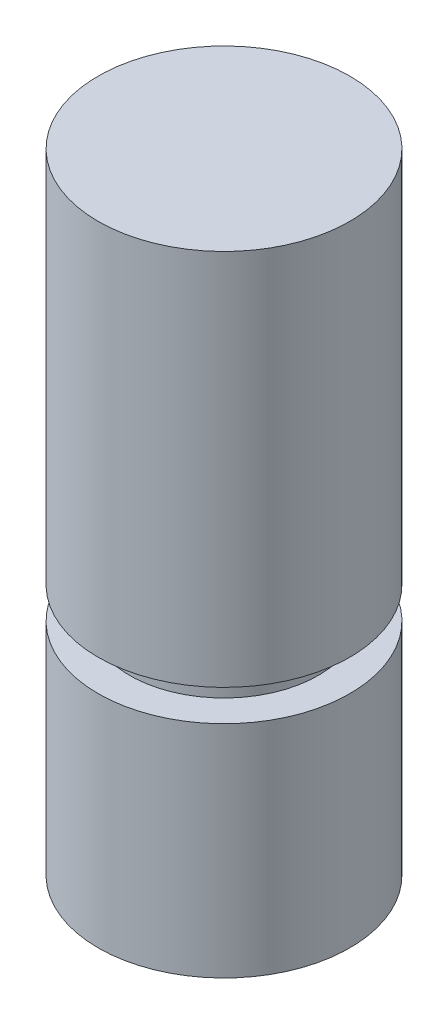
ISO-10303-21;
HEADER;
FILE_DESCRIPTION(('STEP AP214'),'2;1');
FILE_NAME('part.step','',(''),(''),'','','');
FILE_SCHEMA(('AUTOMOTIVE_DESIGN { 1 0 10303 214 1 1 1 1 }'));
ENDSEC;
DATA;
#1=APPLICATION_CONTEXT('core data for automotive mechanical design processes');
#2=APPLICATION_PROTOCOL_DEFINITION('international standard','automotive_design',2000,#1);
#3=PRODUCT_CONTEXT('',#1,'mechanical');
#4=PRODUCT('Part','Part','',(#3));
#5=PRODUCT_RELATED_PRODUCT_CATEGORY('part','',(#4));
#6=PRODUCT_DEFINITION_FORMATION('','',#4);
#7=PRODUCT_DEFINITION_CONTEXT('part definition',#1,'design');
#8=PRODUCT_DEFINITION('design','',#6,#7);
#9=PRODUCT_DEFINITION_SHAPE('','',#8);
#10=(LENGTH_UNIT() NAMED_UNIT(*) SI_UNIT(.MILLI.,.METRE.));
#11=(NAMED_UNIT(*) PLANE_ANGLE_UNIT() SI_UNIT($,.RADIAN.));
#12=(NAMED_UNIT(*) SI_UNIT($,.STERADIAN.) SOLID_ANGLE_UNIT());
#13=UNCERTAINTY_MEASURE_WITH_UNIT(LENGTH_MEASURE(1.E-05),#10,'distance_accuracy_value','');
#14=(GEOMETRIC_REPRESENTATION_CONTEXT(3) GLOBAL_UNCERTAINTY_ASSIGNED_CONTEXT((#13)) GLOBAL_UNIT_ASSIGNED_CONTEXT((#10,
#11,#12)) REPRESENTATION_CONTEXT('',''));
#15=CARTESIAN_POINT('',(0.,0.,0.));
#16=DIRECTION('',(0.,0.,1.));
#17=DIRECTION('',(1.,0.,0.));
#18=AXIS2_PLACEMENT_3D('',#15,#16,#17);
#19=CARTESIAN_POINT('',(0.,10.,0.));
#20=DIRECTION('',(0.,-1.,0.));
#21=DIRECTION('',(0.,0.,-1.));
#22=AXIS2_PLACEMENT_3D('',#19,#20,#21);
#23=CYLINDRICAL_SURFACE('',#22,2.);
#24=CARTESIAN_POINT('',(0.,3.5,0.));
#25=DIRECTION('',(0.,-1.,0.));
#26=DIRECTION('',(0.,0.,-1.));
#27=AXIS2_PLACEMENT_3D('',#24,#25,#26);
#28=CIRCLE('',#27,2.);
#29=CARTESIAN_POINT('',(0.,3.5,-2.));
#30=VERTEX_POINT('',#29);
#31=EDGE_CURVE('E42',#30,#30,#28,.T.);
#32=ORIENTED_EDGE('',*,*,#31,.T.);
#33=EDGE_LOOP('',(#32));
#34=FACE_BOUND('',#33,.T.);
#35=CARTESIAN_POINT('',(0.,0.,0.));
#36=DIRECTION('',(0.,1.,0.));
#37=DIRECTION('',(0.,0.,1.));
#38=AXIS2_PLACEMENT_3D('',#35,#36,#37);
#39=CIRCLE('',#38,2.);
#40=CARTESIAN_POINT('',(0.,0.,2.));
#41=VERTEX_POINT('',#40);
#42=EDGE_CURVE('E35',#41,#41,#39,.T.);
#43=ORIENTED_EDGE('',*,*,#42,.T.);
#44=EDGE_LOOP('',(#43));
#45=FACE_BOUND('',#44,.T.);
#46=ADVANCED_FACE('F31',(#34,#45),#23,.T.);
#47=CARTESIAN_POINT('',(0.,0.,0.));
#48=DIRECTION('',(0.,1.,0.));
#49=DIRECTION('',(0.,0.,1.));
#50=AXIS2_PLACEMENT_3D('',#47,#48,#49);
#51=PLANE('',#50);
#52=ORIENTED_EDGE('',*,*,#42,.F.);
#53=EDGE_LOOP('',(#52));
#54=FACE_BOUND('',#53,.T.);
#55=ADVANCED_FACE('F67',(#54),#51,.F.);
#56=CARTESIAN_POINT('',(2.,3.5,0.));
#57=DIRECTION('',(0.,-1.,0.));
#58=DIRECTION('',(0.,0.,-1.));
#59=AXIS2_PLACEMENT_3D('',#56,#57,#58);
#60=PLANE('',#59);
#61=ORIENTED_EDGE('',*,*,#31,.F.);
#62=EDGE_LOOP('',(#61));
#63=FACE_BOUND('',#62,.T.);
#64=CARTESIAN_POINT('',(0.,3.5,0.));
#65=DIRECTION('',(0.,-1.,0.));
#66=DIRECTION('',(0.,0.,-1.));
#67=AXIS2_PLACEMENT_3D('',#64,#65,#66);
#68=CIRCLE('',#67,1.5);
#69=CARTESIAN_POINT('',(0.,3.5,-1.5));
#70=VERTEX_POINT('',#69);
#71=EDGE_CURVE('E46',#70,#70,#68,.T.);
#72=ORIENTED_EDGE('',*,*,#71,.T.);
#73=EDGE_LOOP('',(#72));
#74=FACE_BOUND('',#73,.T.);
#75=ADVANCED_FACE('F74',(#63,#74),#60,.F.);
#76=CARTESIAN_POINT('',(0.,0.,0.));
#77=DIRECTION('',(0.,-1.,0.));
#78=DIRECTION('',(0.,0.,-1.));
#79=AXIS2_PLACEMENT_3D('',#76,#77,#78);
#80=CYLINDRICAL_SURFACE('',#79,1.5);
#81=ORIENTED_EDGE('',*,*,#71,.F.);
#82=EDGE_LOOP('',(#81));
#83=FACE_BOUND('',#82,.T.);
#84=CARTESIAN_POINT('',(0.,4.,0.));
#85=DIRECTION('',(0.,-1.,0.));
#86=DIRECTION('',(0.,0.,-1.));
#87=AXIS2_PLACEMENT_3D('',#84,#85,#86);
#88=CIRCLE('',#87,1.5);
#89=CARTESIAN_POINT('',(0.,4.,-1.5));
#90=VERTEX_POINT('',#89);
#91=EDGE_CURVE('E49',#90,#90,#88,.T.);
#92=ORIENTED_EDGE('',*,*,#91,.T.);
#93=EDGE_LOOP('',(#92));
#94=FACE_BOUND('',#93,.T.);
#95=ADVANCED_FACE('F82',(#83,#94),#80,.T.);
#96=CARTESIAN_POINT('',(2.,4.,0.));
#97=DIRECTION('',(0.,1.,0.));
#98=DIRECTION('',(0.,0.,1.));
#99=AXIS2_PLACEMENT_3D('',#96,#97,#98);
#100=PLANE('',#99);
#101=ORIENTED_EDGE('',*,*,#91,.F.);
#102=EDGE_LOOP('',(#101));
#103=FACE_BOUND('',#102,.T.);
#104=CARTESIAN_POINT('',(0.,4.,0.));
#105=DIRECTION('',(0.,-1.,0.));
#106=DIRECTION('',(0.,0.,-1.));
#107=AXIS2_PLACEMENT_3D('',#104,#105,#106);
#108=CIRCLE('',#107,2.);
#109=CARTESIAN_POINT('',(0.,4.,-2.));
#110=VERTEX_POINT('',#109);
#111=EDGE_CURVE('E52',#110,#110,#108,.T.);
#112=ORIENTED_EDGE('',*,*,#111,.T.);
#113=EDGE_LOOP('',(#112));
#114=FACE_BOUND('',#113,.T.);
#115=ADVANCED_FACE('F56',(#103,#114),#100,.F.);
#116=CARTESIAN_POINT('',(0.,10.,0.));
#117=DIRECTION('',(0.,1.,0.));
#118=DIRECTION('',(0.,0.,1.));
#119=AXIS2_PLACEMENT_3D('',#116,#117,#118);
#120=PLANE('',#119);
#121=CARTESIAN_POINT('',(0.,10.,0.));
#122=DIRECTION('',(0.,1.,0.));
#123=DIRECTION('',(0.,0.,1.));
#124=AXIS2_PLACEMENT_3D('',#121,#122,#123);
#125=CIRCLE('',#124,2.);
#126=CARTESIAN_POINT('',(0.,10.,2.));
#127=VERTEX_POINT('',#126);
#128=EDGE_CURVE('E10',#127,#127,#125,.T.);
#129=ORIENTED_EDGE('',*,*,#128,.T.);
#130=EDGE_LOOP('',(#129));
#131=FACE_BOUND('',#130,.T.);
#132=ADVANCED_FACE('F60',(#131),#120,.T.);
#133=ORIENTED_EDGE('',*,*,#111,.F.);
#134=EDGE_LOOP('',(#133));
#135=FACE_BOUND('',#134,.T.);
#136=ORIENTED_EDGE('',*,*,#128,.F.);
#137=EDGE_LOOP('',(#136));
#138=FACE_BOUND('',#137,.T.);
#139=ADVANCED_FACE('F33',(#135,#138),#23,.T.);
#140=CLOSED_SHELL('',(#46,#55,#75,#95,#115,#132,#139));
#141=MANIFOLD_SOLID_BREP('B2',#140);
#142=ADVANCED_BREP_SHAPE_REPRESENTATION('',(#18,#141),#14);
#143=SHAPE_DEFINITION_REPRESENTATION(#9,#142);
ENDSEC;
END-ISO-10303-21;
